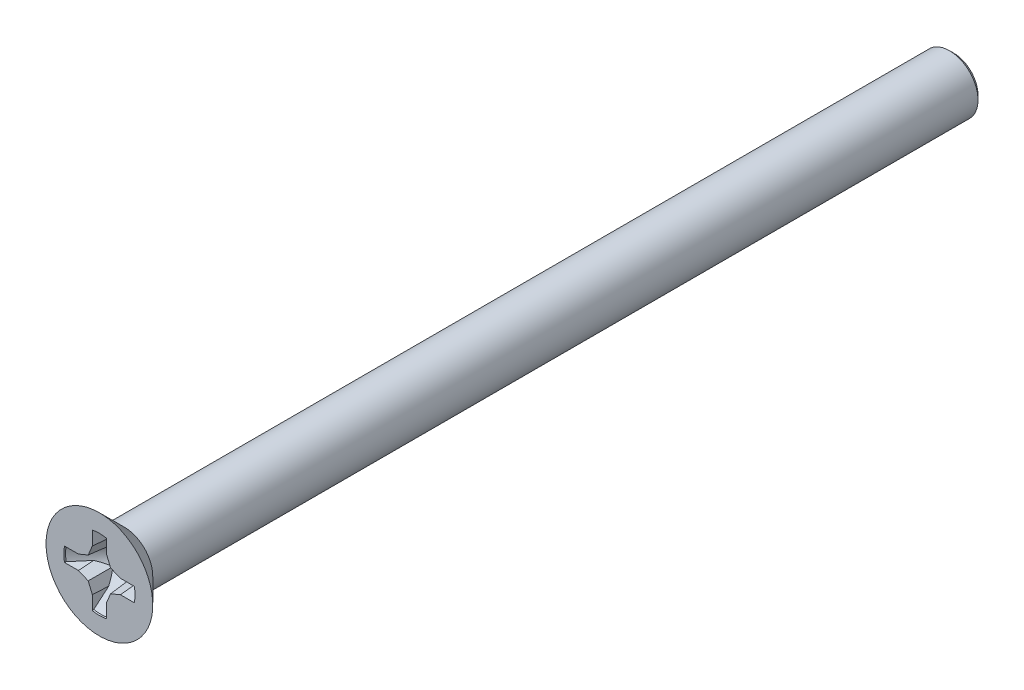
ISO-10303-21;
HEADER;
FILE_DESCRIPTION(('STEP AP214'),'2;1');
FILE_NAME('part.step','',(''),(''),'','','');
FILE_SCHEMA(('AUTOMOTIVE_DESIGN { 1 0 10303 214 1 1 1 1 }'));
ENDSEC;
DATA;
#1=APPLICATION_CONTEXT('core data for automotive mechanical design processes');
#2=APPLICATION_PROTOCOL_DEFINITION('international standard','automotive_design',2000,#1);
#3=PRODUCT_CONTEXT('',#1,'mechanical');
#4=PRODUCT('Part','Part','',(#3));
#5=PRODUCT_RELATED_PRODUCT_CATEGORY('part','',(#4));
#6=PRODUCT_DEFINITION_FORMATION('','',#4);
#7=PRODUCT_DEFINITION_CONTEXT('part definition',#1,'design');
#8=PRODUCT_DEFINITION('design','',#6,#7);
#9=PRODUCT_DEFINITION_SHAPE('','',#8);
#10=(LENGTH_UNIT() NAMED_UNIT(*) SI_UNIT(.MILLI.,.METRE.));
#11=(NAMED_UNIT(*) PLANE_ANGLE_UNIT() SI_UNIT($,.RADIAN.));
#12=(NAMED_UNIT(*) SI_UNIT($,.STERADIAN.) SOLID_ANGLE_UNIT());
#13=UNCERTAINTY_MEASURE_WITH_UNIT(LENGTH_MEASURE(1.E-05),#10,'distance_accuracy_value','');
#14=(GEOMETRIC_REPRESENTATION_CONTEXT(3) GLOBAL_UNCERTAINTY_ASSIGNED_CONTEXT((#13)) GLOBAL_UNIT_ASSIGNED_CONTEXT((#10,
#11,#12)) REPRESENTATION_CONTEXT('',''));
#15=CARTESIAN_POINT('',(0.,0.,0.));
#16=DIRECTION('',(0.,0.,1.));
#17=DIRECTION('',(1.,0.,0.));
#18=AXIS2_PLACEMENT_3D('',#15,#16,#17);
#19=CARTESIAN_POINT('',(0.500000000000026,-2.44948974278317,2.2));
#20=DIRECTION('',(-0.996194698091746,0.,0.0871557427476584));
#21=DIRECTION('',(0.,1.,0.));
#22=AXIS2_PLACEMENT_3D('',#19,#20,#21);
#23=PLANE('',#22);
#24=CARTESIAN_POINT('',(0.407324383999236,-1.45631054521119,1.14071286192047));
#25=CARTESIAN_POINT('',(0.438895455571679,-1.82218846608027,1.50157186124767));
#26=CARTESIAN_POINT('',(0.491456261529248,-2.42452511645569,2.1023446224179));
#27=(BOUNDED_CURVE() B_SPLINE_CURVE(2,(#24,#25,#26),.UNSPECIFIED.,.F.,
.F.) B_SPLINE_CURVE_WITH_KNOTS((3,3),(-0.0502307633060338,-0.0167180936561359),
.UNSPECIFIED.) CURVE() GEOMETRIC_REPRESENTATION_ITEM() RATIONAL_B_SPLINE_CURVE((2.16666900214285,
1.79889986437871,1.40255352692601)) REPRESENTATION_ITEM(''));
#28=CARTESIAN_POINT('',(0.407324383999526,-1.45631054521456,1.14071286192379));
#29=VERTEX_POINT('',#28);
#30=CARTESIAN_POINT('',(0.491456261529248,-2.42452511645569,2.1023446224179));
#31=VERTEX_POINT('',#30);
#32=EDGE_CURVE('E292',#29,#31,#27,.T.);
#33=ORIENTED_EDGE('',*,*,#32,.T.);
#34=DIRECTION('',(0.0844599239044589,-0.246790143112909,0.965381347715172));
#35=VECTOR('',#34,1.);
#36=CARTESIAN_POINT('',(0.491456261529248,-2.42452511645569,2.1023446224179));
#37=LINE('',#36,#35);
#38=CARTESIAN_POINT('',(0.500000000000026,-2.44948974278317,2.2));
#39=VERTEX_POINT('',#38);
#40=EDGE_CURVE('E413',#31,#39,#37,.T.);
#41=ORIENTED_EDGE('',*,*,#40,.T.);
#42=DIRECTION('',(0.,1.,0.));
#43=VECTOR('',#42,1.);
#44=CARTESIAN_POINT('',(0.500000000000026,-2.44948974278317,2.2));
#45=LINE('',#44,#43);
#46=CARTESIAN_POINT('',(0.500000000000016,-1.47474487139158,2.2));
#47=VERTEX_POINT('',#46);
#48=EDGE_CURVE('E456',#39,#47,#45,.T.);
#49=ORIENTED_EDGE('',*,*,#48,.T.);
#50=DIRECTION('',(0.0871426484044399,-0.0173337504938593,0.996045029063886));
#51=VECTOR('',#50,1.);
#52=CARTESIAN_POINT('',(0.500000000000016,-1.47474487139158,2.2));
#53=LINE('',#52,#51);
#54=EDGE_CURVE('E10',#29,#47,#53,.T.);
#55=ORIENTED_EDGE('',*,*,#54,.F.);
#56=EDGE_LOOP('',(#33,#41,#49,#55));
#57=FACE_BOUND('',#56,.T.);
#58=ADVANCED_FACE('F16',(#57),#23,.T.);
#59=CARTESIAN_POINT('',(0.500000000000016,-1.47474487139158,2.2));
#60=DIRECTION('',(-0.920363891963228,0.381227206369644,0.0871557427476583));
#61=DIRECTION('',(0.0942752822069814,0.,0.995546167269401));
#62=AXIS2_PLACEMENT_3D('',#59,#60,#61);
#63=PLANE('',#62);
#64=CARTESIAN_POINT('',(0.677460402999254,-0.677460402997918,0.58658499186893));
#65=CARTESIAN_POINT('',(0.568014544026815,-0.971532360593278,0.717135358188932));
#66=CARTESIAN_POINT('',(0.40732438399968,-1.4563105452141,1.14071286192338));
#67=(BOUNDED_CURVE() B_SPLINE_CURVE(2,(#64,#65,#66),.UNSPECIFIED.,.F.,
.F.) B_SPLINE_CURVE_WITH_KNOTS((3,3),(-0.314713883632195,-0.142510550070693),
.UNSPECIFIED.) CURVE() GEOMETRIC_REPRESENTATION_ITEM() RATIONAL_B_SPLINE_CURVE((2.54190043462429,
2.36011495061725,1.91562167133786)) REPRESENTATION_ITEM(''));
#68=CARTESIAN_POINT('',(0.677460402998895,-0.677460402998881,0.586584991869358));
#69=VERTEX_POINT('',#68);
#70=EDGE_CURVE('E261',#69,#29,#67,.T.);
#71=ORIENTED_EDGE('',*,*,#70,.T.);
#72=ORIENTED_EDGE('',*,*,#54,.T.);
#73=DIRECTION('',(0.38268343236508,0.923879532511291,0.));
#74=VECTOR('',#73,1.);
#75=CARTESIAN_POINT('',(0.500000000000016,-1.47474487139158,2.2));
#76=LINE('',#75,#74);
#77=CARTESIAN_POINT('',(0.785496162903796,-0.785496162903779,2.2));
#78=VERTEX_POINT('',#77);
#79=EDGE_CURVE('E408',#47,#78,#76,.T.);
#80=ORIENTED_EDGE('',*,*,#79,.T.);
#81=DIRECTION('',(0.066662691346833,-0.0666626913468316,0.995546167269401));
#82=VECTOR('',#81,1.);
#83=CARTESIAN_POINT('',(0.785496162903796,-0.785496162903779,2.2));
#84=LINE('',#83,#82);
#85=EDGE_CURVE('E27',#69,#78,#84,.T.);
#86=ORIENTED_EDGE('',*,*,#85,.F.);
#87=EDGE_LOOP('',(#71,#72,#80,#86));
#88=FACE_BOUND('',#87,.T.);
#89=ADVANCED_FACE('F544',(#88),#63,.T.);
#90=CARTESIAN_POINT('',(0.785496162903796,-0.785496162903779,2.2));
#91=DIRECTION('',(-0.381227206369663,0.92036389196322,0.0871557427476584));
#92=DIRECTION('',(0.222868776578231,0.,0.974848454082235));
#93=AXIS2_PLACEMENT_3D('',#90,#91,#92);
#94=PLANE('',#93);
#95=CARTESIAN_POINT('',(1.45631054521411,-0.407324383999649,1.14071286192338));
#96=CARTESIAN_POINT('',(0.971532360593293,-0.568014544026793,0.717135358188936));
#97=CARTESIAN_POINT('',(0.677460402997936,-0.677460402999238,0.586584991868932));
#98=(BOUNDED_CURVE() B_SPLINE_CURVE(2,(#95,#96,#97),.UNSPECIFIED.,.F.,
.F.) B_SPLINE_CURVE_WITH_KNOTS((3,3),(-0.725235736114305,-0.553032402552804),
.UNSPECIFIED.) CURVE() GEOMETRIC_REPRESENTATION_ITEM() RATIONAL_B_SPLINE_CURVE((1.91562167133786,
2.36011495061725,2.54190043462429)) REPRESENTATION_ITEM(''));
#99=CARTESIAN_POINT('',(1.45631054521457,-0.407324383999496,1.14071286192379));
#100=VERTEX_POINT('',#99);
#101=EDGE_CURVE('E254',#100,#69,#98,.T.);
#102=ORIENTED_EDGE('',*,*,#101,.T.);
#103=ORIENTED_EDGE('',*,*,#85,.T.);
#104=DIRECTION('',(0.923879532511283,0.3826834323651,0.));
#105=VECTOR('',#104,1.);
#106=CARTESIAN_POINT('',(0.785496162903796,-0.785496162903779,2.2));
#107=LINE('',#106,#105);
#108=CARTESIAN_POINT('',(1.47474487139159,-0.499999999999985,2.2));
#109=VERTEX_POINT('',#108);
#110=EDGE_CURVE('E335',#78,#109,#107,.T.);
#111=ORIENTED_EDGE('',*,*,#110,.T.);
#112=DIRECTION('',(0.0173337504938611,-0.0871426484044395,0.996045029063886));
#113=VECTOR('',#112,1.);
#114=CARTESIAN_POINT('',(1.47474487139159,-0.499999999999985,2.2));
#115=LINE('',#114,#113);
#116=EDGE_CURVE('E286',#100,#109,#115,.T.);
#117=ORIENTED_EDGE('',*,*,#116,.F.);
#118=EDGE_LOOP('',(#102,#103,#111,#117));
#119=FACE_BOUND('',#118,.T.);
#120=ADVANCED_FACE('F550',(#119),#94,.T.);
#121=CARTESIAN_POINT('',(1.47474487139159,-0.499999999999985,2.2));
#122=DIRECTION('',(0.,0.996194698091746,0.0871557427476584));
#123=DIRECTION('',(1.,0.,1.19723442951276E-13));
#124=AXIS2_PLACEMENT_3D('',#121,#122,#123);
#125=PLANE('',#124);
#126=CARTESIAN_POINT('',(2.42452511645571,-0.491456261529207,2.10234462241791));
#127=CARTESIAN_POINT('',(1.82218846608288,-0.438895455571875,1.50157186125027));
#128=CARTESIAN_POINT('',(1.45631054521457,-0.407324383999502,1.14071286192379));
#129=(BOUNDED_CURVE() B_SPLINE_CURVE(2,(#126,#127,#128),.UNSPECIFIED.,.F.,
.F.) B_SPLINE_CURVE_WITH_KNOTS((3,3),(-0.946313996596915,-0.912801326947203),
.UNSPECIFIED.) CURVE() GEOMETRIC_REPRESENTATION_ITEM() RATIONAL_B_SPLINE_CURVE((1.40255352692601,
1.79889986437651,2.16666900213877)) REPRESENTATION_ITEM(''));
#130=CARTESIAN_POINT('',(2.4245251164557,-0.491456261529198,2.1023446224179));
#131=VERTEX_POINT('',#130);
#132=EDGE_CURVE('E228',#131,#100,#129,.T.);
#133=ORIENTED_EDGE('',*,*,#132,.T.);
#134=ORIENTED_EDGE('',*,*,#116,.T.);
#135=DIRECTION('',(1.,0.,0.));
#136=VECTOR('',#135,1.);
#137=CARTESIAN_POINT('',(1.47474487139159,-0.499999999999985,2.2));
#138=LINE('',#137,#136);
#139=CARTESIAN_POINT('',(2.44948974278318,-0.499999999999975,2.2));
#140=VERTEX_POINT('',#139);
#141=EDGE_CURVE('E231',#109,#140,#138,.T.);
#142=ORIENTED_EDGE('',*,*,#141,.T.);
#143=DIRECTION('',(0.246790143112909,-0.0844599239044548,0.965381347715173));
#144=VECTOR('',#143,1.);
#145=CARTESIAN_POINT('',(2.4245251164557,-0.491456261529198,2.1023446224179));
#146=LINE('',#145,#144);
#147=EDGE_CURVE('E224',#131,#140,#146,.T.);
#148=ORIENTED_EDGE('',*,*,#147,.F.);
#149=EDGE_LOOP('',(#133,#134,#142,#148));
#150=FACE_BOUND('',#149,.T.);
#151=ADVANCED_FACE('F226',(#150),#125,.T.);
#152=CARTESIAN_POINT('',(-2.44948974278317,-0.500000000000017,2.2));
#153=DIRECTION('',(0.,0.996194698091746,0.0871557427476584));
#154=DIRECTION('',(1.,0.,0.));
#155=AXIS2_PLACEMENT_3D('',#152,#153,#154);
#156=PLANE('',#155);
#157=CARTESIAN_POINT('',(-1.4563105452112,-0.407324383999231,1.14071286192047));
#158=CARTESIAN_POINT('',(-1.82218846608027,-0.438895455571672,1.50157186124767));
#159=CARTESIAN_POINT('',(-2.42452511645569,-0.49145626152924,2.1023446224179));
#160=(BOUNDED_CURVE() B_SPLINE_CURVE(2,(#157,#158,#159),.UNSPECIFIED.,.F.,
.F.) B_SPLINE_CURVE_WITH_KNOTS((3,3),(-0.0502307633060338,-0.0167180936561359),
.UNSPECIFIED.) CURVE() GEOMETRIC_REPRESENTATION_ITEM() RATIONAL_B_SPLINE_CURVE((2.16666900214285,
1.79889986437871,1.40255352692601)) REPRESENTATION_ITEM(''));
#161=CARTESIAN_POINT('',(-1.45631054521456,-0.407324383999521,1.14071286192379));
#162=VERTEX_POINT('',#161);
#163=CARTESIAN_POINT('',(-2.42452511645569,-0.49145626152924,2.1023446224179));
#164=VERTEX_POINT('',#163);
#165=EDGE_CURVE('E599',#162,#164,#160,.T.);
#166=ORIENTED_EDGE('',*,*,#165,.T.);
#167=DIRECTION('',(-0.246790143112909,-0.0844599239044562,0.965381347715173));
#168=VECTOR('',#167,1.);
#169=CARTESIAN_POINT('',(-2.42452511645569,-0.49145626152924,2.1023446224179));
#170=LINE('',#169,#168);
#171=CARTESIAN_POINT('',(-2.44948974278317,-0.500000000000017,2.2));
#172=VERTEX_POINT('',#171);
#173=EDGE_CURVE('E291',#164,#172,#170,.T.);
#174=ORIENTED_EDGE('',*,*,#173,.T.);
#175=DIRECTION('',(1.,0.,0.));
#176=VECTOR('',#175,1.);
#177=CARTESIAN_POINT('',(-2.44948974278317,-0.500000000000017,2.2));
#178=LINE('',#177,#176);
#179=CARTESIAN_POINT('',(-1.47474487139159,-0.50000000000001,2.2));
#180=VERTEX_POINT('',#179);
#181=EDGE_CURVE('E348',#172,#180,#178,.T.);
#182=ORIENTED_EDGE('',*,*,#181,.T.);
#183=DIRECTION('',(-0.0173337504938596,-0.0871426484044398,0.996045029063886));
#184=VECTOR('',#183,1.);
#185=CARTESIAN_POINT('',(-1.47474487139159,-0.50000000000001,2.2));
#186=LINE('',#185,#184);
#187=EDGE_CURVE('E280',#162,#180,#186,.T.);
#188=ORIENTED_EDGE('',*,*,#187,.F.);
#189=EDGE_LOOP('',(#166,#174,#182,#188));
#190=FACE_BOUND('',#189,.T.);
#191=ADVANCED_FACE('F588',(#190),#156,.T.);
#192=CARTESIAN_POINT('',(-1.47474487139159,-0.50000000000001,2.2));
#193=DIRECTION('',(0.381227206369647,0.920363891963227,0.0871557427476583));
#194=DIRECTION('',(0.22286877657824,0.,-0.974848454082233));
#195=AXIS2_PLACEMENT_3D('',#192,#193,#194);
#196=PLANE('',#195);
#197=CARTESIAN_POINT('',(-0.67746040299792,-0.677460402999252,0.58658499186893));
#198=CARTESIAN_POINT('',(-0.971532360593278,-0.568014544026811,0.717135358188932));
#199=CARTESIAN_POINT('',(-1.4563105452141,-0.407324383999675,1.14071286192338));
#200=(BOUNDED_CURVE() B_SPLINE_CURVE(2,(#197,#198,#199),.UNSPECIFIED.,.F.,
.F.) B_SPLINE_CURVE_WITH_KNOTS((3,3),(-0.314713883632194,-0.142510550070693),
.UNSPECIFIED.) CURVE() GEOMETRIC_REPRESENTATION_ITEM() RATIONAL_B_SPLINE_CURVE((2.54190043462429,
2.36011495061725,1.91562167133786)) REPRESENTATION_ITEM(''));
#201=CARTESIAN_POINT('',(-0.677460402998883,-0.677460402998893,0.586584991869358));
#202=VERTEX_POINT('',#201);
#203=EDGE_CURVE('E279',#202,#162,#200,.T.);
#204=ORIENTED_EDGE('',*,*,#203,.T.);
#205=ORIENTED_EDGE('',*,*,#187,.T.);
#206=DIRECTION('',(0.92387953251129,-0.382683432365084,0.));
#207=VECTOR('',#206,1.);
#208=CARTESIAN_POINT('',(-1.47474487139159,-0.50000000000001,2.2));
#209=LINE('',#208,#207);
#210=CARTESIAN_POINT('',(-0.785496162903782,-0.785496162903793,2.2));
#211=VERTEX_POINT('',#210);
#212=EDGE_CURVE('E356',#180,#211,#209,.T.);
#213=ORIENTED_EDGE('',*,*,#212,.T.);
#214=DIRECTION('',(-0.0666626913468319,-0.0666626913468328,0.995546167269401));
#215=VECTOR('',#214,1.);
#216=CARTESIAN_POINT('',(-0.785496162903782,-0.785496162903793,2.2));
#217=LINE('',#216,#215);
#218=EDGE_CURVE('E287',#202,#211,#217,.T.);
#219=ORIENTED_EDGE('',*,*,#218,.F.);
#220=EDGE_LOOP('',(#204,#205,#213,#219));
#221=FACE_BOUND('',#220,.T.);
#222=ADVANCED_FACE('F559',(#221),#196,.T.);
#223=CARTESIAN_POINT('',(-0.785496162903782,-0.785496162903793,2.2));
#224=DIRECTION('',(0.920363891963222,0.38122720636966,0.0871557427476583));
#225=DIRECTION('',(0.,0.222868776578233,-0.974848454082234));
#226=AXIS2_PLACEMENT_3D('',#223,#224,#225);
#227=PLANE('',#226);
#228=CARTESIAN_POINT('',(-0.407324383999653,-1.45631054521411,1.14071286192339));
#229=CARTESIAN_POINT('',(-0.568014544026797,-0.971532360593289,0.717135358188932));
#230=CARTESIAN_POINT('',(-0.67746040299924,-0.67746040299793,0.58658499186893));
#231=(BOUNDED_CURVE() B_SPLINE_CURVE(2,(#228,#229,#230),.UNSPECIFIED.,.F.,
.F.) B_SPLINE_CURVE_WITH_KNOTS((3,3),(-0.725235736114305,-0.553032402552803),
.UNSPECIFIED.) CURVE() GEOMETRIC_REPRESENTATION_ITEM() RATIONAL_B_SPLINE_CURVE((1.91562167133786,
2.36011495061725,2.54190043462429)) REPRESENTATION_ITEM(''));
#232=CARTESIAN_POINT('',(-0.407324383999501,-1.45631054521457,1.14071286192379));
#233=VERTEX_POINT('',#232);
#234=EDGE_CURVE('E269',#233,#202,#231,.T.);
#235=ORIENTED_EDGE('',*,*,#234,.T.);
#236=ORIENTED_EDGE('',*,*,#218,.T.);
#237=DIRECTION('',(0.382683432365096,-0.923879532511284,0.));
#238=VECTOR('',#237,1.);
#239=CARTESIAN_POINT('',(-0.785496162903782,-0.785496162903793,2.2));
#240=LINE('',#239,#238);
#241=CARTESIAN_POINT('',(-0.49999999999999,-1.47474487139159,2.2));
#242=VERTEX_POINT('',#241);
#243=EDGE_CURVE('E400',#211,#242,#240,.T.);
#244=ORIENTED_EDGE('',*,*,#243,.T.);
#245=DIRECTION('',(-0.0871426484044396,-0.0173337504938608,0.996045029063886));
#246=VECTOR('',#245,1.);
#247=CARTESIAN_POINT('',(-0.49999999999999,-1.47474487139159,2.2));
#248=LINE('',#247,#246);
#249=EDGE_CURVE('E409',#233,#242,#248,.T.);
#250=ORIENTED_EDGE('',*,*,#249,.F.);
#251=EDGE_LOOP('',(#235,#236,#244,#250));
#252=FACE_BOUND('',#251,.T.);
#253=ADVANCED_FACE('F555',(#252),#227,.T.);
#254=CARTESIAN_POINT('',(-0.49999999999999,-1.47474487139159,2.2));
#255=DIRECTION('',(0.996194698091746,0.,0.0871557427476584));
#256=DIRECTION('',(0.,-1.,0.));
#257=AXIS2_PLACEMENT_3D('',#254,#255,#256);
#258=PLANE('',#257);
#259=CARTESIAN_POINT('',(-0.491456261529206,-2.4245251164557,2.1023446224179));
#260=CARTESIAN_POINT('',(-0.438895455571874,-1.82218846608288,1.50157186125026));
#261=CARTESIAN_POINT('',(-0.407324383999501,-1.45631054521457,1.14071286192379));
#262=(BOUNDED_CURVE() B_SPLINE_CURVE(2,(#259,#260,#261),.UNSPECIFIED.,.F.,
.F.) B_SPLINE_CURVE_WITH_KNOTS((3,3),(-0.946313996596915,-0.912801326947203),
.UNSPECIFIED.) CURVE() GEOMETRIC_REPRESENTATION_ITEM() RATIONAL_B_SPLINE_CURVE((1.40255352692601,
1.79889986437651,2.16666900213878)) REPRESENTATION_ITEM(''));
#263=CARTESIAN_POINT('',(-0.491456261529206,-2.4245251164557,2.1023446224179));
#264=VERTEX_POINT('',#263);
#265=EDGE_CURVE('E278',#264,#233,#262,.T.);
#266=ORIENTED_EDGE('',*,*,#265,.T.);
#267=ORIENTED_EDGE('',*,*,#249,.T.);
#268=DIRECTION('',(0.,-1.,0.));
#269=VECTOR('',#268,1.);
#270=CARTESIAN_POINT('',(-0.49999999999999,-1.47474487139159,2.2));
#271=LINE('',#270,#269);
#272=CARTESIAN_POINT('',(-0.499999999999983,-2.44948974278318,2.2));
#273=VERTEX_POINT('',#272);
#274=EDGE_CURVE('E444',#242,#273,#271,.T.);
#275=ORIENTED_EDGE('',*,*,#274,.T.);
#276=DIRECTION('',(-0.0844599239044562,-0.246790143112909,0.965381347715173));
#277=VECTOR('',#276,1.);
#278=CARTESIAN_POINT('',(-0.491456261529206,-2.4245251164557,2.1023446224179));
#279=LINE('',#278,#277);
#280=EDGE_CURVE('E442',#264,#273,#279,.T.);
#281=ORIENTED_EDGE('',*,*,#280,.F.);
#282=EDGE_LOOP('',(#266,#267,#275,#281));
#283=FACE_BOUND('',#282,.T.);
#284=ADVANCED_FACE('F558',(#283),#258,.T.);
#285=CARTESIAN_POINT('',(0.,0.,2.2));
#286=DIRECTION('',(0.,0.,1.));
#287=DIRECTION('',(-1.,0.,0.));
#288=AXIS2_PLACEMENT_3D('',#285,#286,#287);
#289=CONICAL_SURFACE('',#288,2.5,0.26179938779915);
#290=CARTESIAN_POINT('',(0.,0.,2.1023446224179));
#291=DIRECTION('',(0.,0.,-1.));
#292=DIRECTION('',(0.,-1.,0.));
#293=AXIS2_PLACEMENT_3D('',#290,#291,#292);
#294=CIRCLE('',#293,2.47383332044032);
#295=EDGE_CURVE('E297',#31,#264,#294,.T.);
#296=ORIENTED_EDGE('',*,*,#295,.T.);
#297=ORIENTED_EDGE('',*,*,#280,.T.);
#298=CARTESIAN_POINT('',(0.,0.,2.2));
#299=DIRECTION('',(0.,0.,1.));
#300=DIRECTION('',(-1.,0.,0.));
#301=AXIS2_PLACEMENT_3D('',#298,#299,#300);
#302=CIRCLE('',#301,2.5);
#303=EDGE_CURVE('E448',#273,#39,#302,.T.);
#304=ORIENTED_EDGE('',*,*,#303,.T.);
#305=ORIENTED_EDGE('',*,*,#40,.F.);
#306=EDGE_LOOP('',(#296,#297,#304,#305));
#307=FACE_BOUND('',#306,.T.);
#308=ADVANCED_FACE('F562',(#307),#289,.F.);
#309=CARTESIAN_POINT('',(-0.500000000000009,2.44948974278318,2.2));
#310=DIRECTION('',(0.996194698091746,0.,0.0871557427476584));
#311=DIRECTION('',(0.,-1.,0.));
#312=AXIS2_PLACEMENT_3D('',#309,#310,#311);
#313=PLANE('',#312);
#314=CARTESIAN_POINT('',(-0.407324383999231,1.4563105452112,1.14071286192047));
#315=CARTESIAN_POINT('',(-0.438895455571673,1.82218846608027,1.50157186124767));
#316=CARTESIAN_POINT('',(-0.49145626152924,2.42452511645569,2.10234462241791));
#317=(BOUNDED_CURVE() B_SPLINE_CURVE(2,(#314,#315,#316),.UNSPECIFIED.,.F.,
.F.) B_SPLINE_CURVE_WITH_KNOTS((3,3),(-0.0502307633060337,-0.0167180936561359),
.UNSPECIFIED.) CURVE() GEOMETRIC_REPRESENTATION_ITEM() RATIONAL_B_SPLINE_CURVE((2.16666900214285,
1.7988998643787,1.40255352692601)) REPRESENTATION_ITEM(''));
#318=CARTESIAN_POINT('',(-0.407324383999516,1.45631054521456,1.14071286192379));
#319=VERTEX_POINT('',#318);
#320=CARTESIAN_POINT('',(-0.491456261529231,2.42452511645569,2.1023446224179));
#321=VERTEX_POINT('',#320);
#322=EDGE_CURVE('E383',#319,#321,#317,.T.);
#323=ORIENTED_EDGE('',*,*,#322,.T.);
#324=DIRECTION('',(-0.0844599239044561,0.246790143112912,0.965381347715172));
#325=VECTOR('',#324,1.);
#326=CARTESIAN_POINT('',(-0.491456261529231,2.42452511645569,2.1023446224179));
#327=LINE('',#326,#325);
#328=CARTESIAN_POINT('',(-0.500000000000009,2.44948974278318,2.2));
#329=VERTEX_POINT('',#328);
#330=EDGE_CURVE('E428',#321,#329,#327,.T.);
#331=ORIENTED_EDGE('',*,*,#330,.T.);
#332=DIRECTION('',(0.,-1.,0.));
#333=VECTOR('',#332,1.);
#334=CARTESIAN_POINT('',(-0.500000000000009,2.44948974278318,2.2));
#335=LINE('',#334,#333);
#336=CARTESIAN_POINT('',(-0.5,1.47474487139159,2.2));
#337=VERTEX_POINT('',#336);
#338=EDGE_CURVE('E310',#329,#337,#335,.T.);
#339=ORIENTED_EDGE('',*,*,#338,.T.);
#340=DIRECTION('',(-0.0871426484044397,0.0173337504938599,0.996045029063886));
#341=VECTOR('',#340,1.);
#342=CARTESIAN_POINT('',(-0.5,1.47474487139159,2.2));
#343=LINE('',#342,#341);
#344=EDGE_CURVE('E509',#319,#337,#343,.T.);
#345=ORIENTED_EDGE('',*,*,#344,.F.);
#346=EDGE_LOOP('',(#323,#331,#339,#345));
#347=FACE_BOUND('',#346,.T.);
#348=ADVANCED_FACE('F573',(#347),#313,.T.);
#349=CARTESIAN_POINT('',(-0.5,1.47474487139159,2.2));
#350=DIRECTION('',(0.920363891963226,-0.38122720636965,0.0871557427476583));
#351=DIRECTION('',(0.,-0.222868776578239,-0.974848454082233));
#352=AXIS2_PLACEMENT_3D('',#349,#350,#351);
#353=PLANE('',#352);
#354=CARTESIAN_POINT('',(-0.677460402999248,0.677460402997922,0.58658499186893));
#355=CARTESIAN_POINT('',(-0.568014544026808,0.971532360593281,0.717135358188932));
#356=CARTESIAN_POINT('',(-0.40732438399967,1.4563105452141,1.14071286192338));
#357=(BOUNDED_CURVE() B_SPLINE_CURVE(2,(#354,#355,#356),.UNSPECIFIED.,.F.,
.F.) B_SPLINE_CURVE_WITH_KNOTS((3,3),(-0.314713883632194,-0.142510550070693),
.UNSPECIFIED.) CURVE() GEOMETRIC_REPRESENTATION_ITEM() RATIONAL_B_SPLINE_CURVE((2.54190043462429,
2.36011495061725,1.91562167133786)) REPRESENTATION_ITEM(''));
#358=CARTESIAN_POINT('',(-0.67746040299889,0.677460402998886,0.586584991869358));
#359=VERTEX_POINT('',#358);
#360=EDGE_CURVE('E376',#359,#319,#357,.T.);
#361=ORIENTED_EDGE('',*,*,#360,.T.);
#362=ORIENTED_EDGE('',*,*,#344,.T.);
#363=DIRECTION('',(-0.382683432365086,-0.923879532511288,0.));
#364=VECTOR('',#363,1.);
#365=CARTESIAN_POINT('',(-0.5,1.47474487139159,2.2));
#366=LINE('',#365,#364);
#367=CARTESIAN_POINT('',(-0.78549616290379,0.785496162903785,2.2));
#368=VERTEX_POINT('',#367);
#369=EDGE_CURVE('E304',#337,#368,#366,.T.);
#370=ORIENTED_EDGE('',*,*,#369,.T.);
#371=DIRECTION('',(-0.0666626913468326,0.0666626913468321,0.995546167269401));
#372=VECTOR('',#371,1.);
#373=CARTESIAN_POINT('',(-0.78549616290379,0.785496162903785,2.2));
#374=LINE('',#373,#372);
#375=EDGE_CURVE('E41',#359,#368,#374,.T.);
#376=ORIENTED_EDGE('',*,*,#375,.F.);
#377=EDGE_LOOP('',(#361,#362,#370,#376));
#378=FACE_BOUND('',#377,.T.);
#379=ADVANCED_FACE('F576',(#378),#353,.T.);
#380=CARTESIAN_POINT('',(-0.78549616290379,0.785496162903785,2.2));
#381=DIRECTION('',(0.381227206369657,-0.920363891963223,0.0871557427476584));
#382=DIRECTION('',(0.,-0.0942752822069821,-0.995546167269401));
#383=AXIS2_PLACEMENT_3D('',#380,#381,#382);
#384=PLANE('',#383);
#385=CARTESIAN_POINT('',(-1.4563105452141,0.40732438399966,1.14071286192338));
#386=CARTESIAN_POINT('',(-0.971532360593285,0.568014544026801,0.717135358188932));
#387=CARTESIAN_POINT('',(-0.677460402997928,0.677460402999244,0.58658499186893));
#388=(BOUNDED_CURVE() B_SPLINE_CURVE(2,(#385,#386,#387),.UNSPECIFIED.,.F.,
.F.) B_SPLINE_CURVE_WITH_KNOTS((3,3),(-0.725235736114304,-0.553032402552803),
.UNSPECIFIED.) CURVE() GEOMETRIC_REPRESENTATION_ITEM() RATIONAL_B_SPLINE_CURVE((1.91562167133786,
2.36011495061725,2.54190043462429)) REPRESENTATION_ITEM(''));
#389=CARTESIAN_POINT('',(-1.45631054521457,0.407324383999506,1.14071286192379));
#390=VERTEX_POINT('',#389);
#391=EDGE_CURVE('E382',#390,#359,#388,.T.);
#392=ORIENTED_EDGE('',*,*,#391,.T.);
#393=ORIENTED_EDGE('',*,*,#375,.T.);
#394=DIRECTION('',(-0.923879532511285,-0.382683432365093,0.));
#395=VECTOR('',#394,1.);
#396=CARTESIAN_POINT('',(-0.78549616290379,0.785496162903785,2.2));
#397=LINE('',#396,#395);
#398=CARTESIAN_POINT('',(-1.47474487139159,0.5,2.2));
#399=VERTEX_POINT('',#398);
#400=EDGE_CURVE('E302',#368,#399,#397,.T.);
#401=ORIENTED_EDGE('',*,*,#400,.T.);
#402=DIRECTION('',(-0.0173337504938605,0.0871426484044397,0.996045029063886));
#403=VECTOR('',#402,1.);
#404=CARTESIAN_POINT('',(-1.47474487139159,0.5,2.2));
#405=LINE('',#404,#403);
#406=EDGE_CURVE('E288',#390,#399,#405,.T.);
#407=ORIENTED_EDGE('',*,*,#406,.F.);
#408=EDGE_LOOP('',(#392,#393,#401,#407));
#409=FACE_BOUND('',#408,.T.);
#410=ADVANCED_FACE('F577',(#409),#384,.T.);
#411=CARTESIAN_POINT('',(-1.47474487139159,0.5,2.2));
#412=DIRECTION('',(0.,-0.996194698091746,0.0871557427476584));
#413=DIRECTION('',(-1.,0.,0.));
#414=AXIS2_PLACEMENT_3D('',#411,#412,#413);
#415=PLANE('',#414);
#416=CARTESIAN_POINT('',(-2.4245251164557,0.491456261529214,2.1023446224179));
#417=CARTESIAN_POINT('',(-1.82218846608288,0.43889545557188,1.50157186125026));
#418=CARTESIAN_POINT('',(-1.45631054521457,0.407324383999506,1.14071286192379));
#419=(BOUNDED_CURVE() B_SPLINE_CURVE(2,(#416,#417,#418),.UNSPECIFIED.,.F.,
.F.) B_SPLINE_CURVE_WITH_KNOTS((3,3),(-0.946313996596915,-0.912801326947203),
.UNSPECIFIED.) CURVE() GEOMETRIC_REPRESENTATION_ITEM() RATIONAL_B_SPLINE_CURVE((1.40255352692601,
1.79889986437651,2.16666900213878)) REPRESENTATION_ITEM(''));
#420=CARTESIAN_POINT('',(-2.4245251164557,0.491456261529215,2.1023446224179));
#421=VERTEX_POINT('',#420);
#422=EDGE_CURVE('E487',#421,#390,#419,.T.);
#423=ORIENTED_EDGE('',*,*,#422,.T.);
#424=ORIENTED_EDGE('',*,*,#406,.T.);
#425=DIRECTION('',(-1.,0.,0.));
#426=VECTOR('',#425,1.);
#427=CARTESIAN_POINT('',(-1.47474487139159,0.5,2.2));
#428=LINE('',#427,#426);
#429=CARTESIAN_POINT('',(-2.44948974278318,0.499999999999992,2.2));
#430=VERTEX_POINT('',#429);
#431=EDGE_CURVE('E305',#399,#430,#428,.T.);
#432=ORIENTED_EDGE('',*,*,#431,.T.);
#433=DIRECTION('',(-0.246790143112904,0.0844599239044577,0.965381347715174));
#434=VECTOR('',#433,1.);
#435=CARTESIAN_POINT('',(-2.4245251164557,0.491456261529215,2.1023446224179));
#436=LINE('',#435,#434);
#437=EDGE_CURVE('E267',#421,#430,#436,.T.);
#438=ORIENTED_EDGE('',*,*,#437,.F.);
#439=EDGE_LOOP('',(#423,#424,#432,#438));
#440=FACE_BOUND('',#439,.T.);
#441=ADVANCED_FACE('F580',(#440),#415,.T.);
#442=CARTESIAN_POINT('',(0.,0.,2.2));
#443=DIRECTION('',(0.,0.,1.));
#444=DIRECTION('',(0.,1.,0.));
#445=AXIS2_PLACEMENT_3D('',#442,#443,#444);
#446=CONICAL_SURFACE('',#445,2.5,0.26179938779915);
#447=CARTESIAN_POINT('',(0.,0.,2.1023446224179));
#448=DIRECTION('',(0.,0.,-1.));
#449=DIRECTION('',(0.,-1.,0.));
#450=AXIS2_PLACEMENT_3D('',#447,#448,#449);
#451=CIRCLE('',#450,2.47383332044032);
#452=CARTESIAN_POINT('',(-2.47383332044033,0.,2.10234462241791));
#453=VERTEX_POINT('',#452);
#454=EDGE_CURVE('E404',#164,#453,#451,.T.);
#455=ORIENTED_EDGE('',*,*,#454,.T.);
#456=CARTESIAN_POINT('',(0.,0.,2.1023446224179));
#457=DIRECTION('',(0.,0.,-1.));
#458=DIRECTION('',(0.,-1.,0.));
#459=AXIS2_PLACEMENT_3D('',#456,#457,#458);
#460=CIRCLE('',#459,2.47383332044032);
#461=EDGE_CURVE('E237',#453,#421,#460,.T.);
#462=ORIENTED_EDGE('',*,*,#461,.T.);
#463=ORIENTED_EDGE('',*,*,#437,.T.);
#464=CARTESIAN_POINT('',(0.,0.,2.2));
#465=DIRECTION('',(0.,0.,1.));
#466=DIRECTION('',(0.,1.,0.));
#467=AXIS2_PLACEMENT_3D('',#464,#465,#466);
#468=CIRCLE('',#467,2.5);
#469=EDGE_CURVE('E355',#430,#172,#468,.T.);
#470=ORIENTED_EDGE('',*,*,#469,.T.);
#471=ORIENTED_EDGE('',*,*,#173,.F.);
#472=EDGE_LOOP('',(#455,#462,#463,#470,#471));
#473=FACE_BOUND('',#472,.T.);
#474=ADVANCED_FACE('F571',(#473),#446,.F.);
#475=CARTESIAN_POINT('',(2.44948974278318,0.5,2.2));
#476=DIRECTION('',(0.,-0.996194698091746,0.0871557427476584));
#477=DIRECTION('',(-1.,0.,0.));
#478=AXIS2_PLACEMENT_3D('',#475,#476,#477);
#479=PLANE('',#478);
#480=CARTESIAN_POINT('',(1.45631054521456,0.407324383999511,1.14071286192379));
#481=CARTESIAN_POINT('',(1.82218846608287,0.438895455571887,1.50157186125026));
#482=CARTESIAN_POINT('',(2.42452511645569,0.491456261529224,2.1023446224179));
#483=(BOUNDED_CURVE() B_SPLINE_CURVE(2,(#480,#481,#482),.UNSPECIFIED.,.F.,
.F.) B_SPLINE_CURVE_WITH_KNOTS((3,3),(0.912801326947203,0.946313996596915),
.UNSPECIFIED.) CURVE() GEOMETRIC_REPRESENTATION_ITEM() RATIONAL_B_SPLINE_CURVE((2.16666900213878,
1.79889986437651,1.40255352692601)) REPRESENTATION_ITEM(''));
#484=CARTESIAN_POINT('',(1.45631054521456,0.407324383999511,1.14071286192379));
#485=VERTEX_POINT('',#484);
#486=CARTESIAN_POINT('',(2.4245251164557,0.491456261529223,2.1023446224179));
#487=VERTEX_POINT('',#486);
#488=EDGE_CURVE('E248',#485,#487,#483,.T.);
#489=ORIENTED_EDGE('',*,*,#488,.T.);
#490=DIRECTION('',(0.246790143112909,0.0844599239044548,0.965381347715173));
#491=VECTOR('',#490,1.);
#492=CARTESIAN_POINT('',(2.4245251164557,0.491456261529223,2.1023446224179));
#493=LINE('',#492,#491);
#494=CARTESIAN_POINT('',(2.44948974278318,0.5,2.2));
#495=VERTEX_POINT('',#494);
#496=EDGE_CURVE('E243',#487,#495,#493,.T.);
#497=ORIENTED_EDGE('',*,*,#496,.T.);
#498=DIRECTION('',(-1.,0.,0.));
#499=VECTOR('',#498,1.);
#500=CARTESIAN_POINT('',(2.44948974278318,0.5,2.2));
#501=LINE('',#500,#499);
#502=CARTESIAN_POINT('',(1.47474487139159,0.5,2.2));
#503=VERTEX_POINT('',#502);
#504=EDGE_CURVE('E336',#495,#503,#501,.T.);
#505=ORIENTED_EDGE('',*,*,#504,.T.);
#506=DIRECTION('',(0.0173337504938602,0.0871426484044397,0.996045029063886));
#507=VECTOR('',#506,1.);
#508=CARTESIAN_POINT('',(1.47474487139159,0.5,2.2));
#509=LINE('',#508,#507);
#510=EDGE_CURVE('E366',#485,#503,#509,.T.);
#511=ORIENTED_EDGE('',*,*,#510,.F.);
#512=EDGE_LOOP('',(#489,#497,#505,#511));
#513=FACE_BOUND('',#512,.T.);
#514=ADVANCED_FACE('F567',(#513),#479,.T.);
#515=CARTESIAN_POINT('',(1.47474487139159,0.5,2.2));
#516=DIRECTION('',(-0.381227206369653,-0.920363891963224,0.0871557427476585));
#517=DIRECTION('',(-0.923879532511287,0.38268343236509,0.));
#518=AXIS2_PLACEMENT_3D('',#515,#516,#517);
#519=PLANE('',#518);
#520=CARTESIAN_POINT('',(0.677460402997926,0.677460402999246,0.58658499186893));
#521=CARTESIAN_POINT('',(0.971532360593285,0.568014544026804,0.717135358188934));
#522=CARTESIAN_POINT('',(1.4563105452141,0.407324383999664,1.14071286192338));
#523=(BOUNDED_CURVE() B_SPLINE_CURVE(2,(#520,#521,#522),.UNSPECIFIED.,.F.,
.F.) B_SPLINE_CURVE_WITH_KNOTS((3,3),(0.553032402552804,0.725235736114305),
.UNSPECIFIED.) CURVE() GEOMETRIC_REPRESENTATION_ITEM() RATIONAL_B_SPLINE_CURVE((2.54190043462429,
2.36011495061725,1.91562167133786)) REPRESENTATION_ITEM(''));
#524=CARTESIAN_POINT('',(0.677460402998888,0.677460402998888,0.586584991869358));
#525=VERTEX_POINT('',#524);
#526=EDGE_CURVE('E347',#525,#485,#523,.T.);
#527=ORIENTED_EDGE('',*,*,#526,.T.);
#528=ORIENTED_EDGE('',*,*,#510,.T.);
#529=DIRECTION('',(-0.923879532511287,0.38268343236509,0.));
#530=VECTOR('',#529,1.);
#531=CARTESIAN_POINT('',(1.47474487139159,0.5,2.2));
#532=LINE('',#531,#530);
#533=CARTESIAN_POINT('',(0.785496162903787,0.785496162903787,2.2));
#534=VERTEX_POINT('',#533);
#535=EDGE_CURVE('E475',#503,#534,#532,.T.);
#536=ORIENTED_EDGE('',*,*,#535,.T.);
#537=DIRECTION('',(0.0666626913468323,0.0666626913468323,0.995546167269401));
#538=VECTOR('',#537,1.);
#539=CARTESIAN_POINT('',(0.785496162903787,0.785496162903787,2.2));
#540=LINE('',#539,#538);
#541=EDGE_CURVE('E363',#525,#534,#540,.T.);
#542=ORIENTED_EDGE('',*,*,#541,.F.);
#543=EDGE_LOOP('',(#527,#528,#536,#542));
#544=FACE_BOUND('',#543,.T.);
#545=ADVANCED_FACE('F570',(#544),#519,.T.);
#546=CARTESIAN_POINT('',(0.785496162903787,0.785496162903787,2.2));
#547=DIRECTION('',(-0.920363891963224,-0.381227206369654,0.0871557427476584));
#548=DIRECTION('',(-0.382683432365091,0.923879532511287,0.));
#549=AXIS2_PLACEMENT_3D('',#546,#547,#548);
#550=PLANE('',#549);
#551=CARTESIAN_POINT('',(0.407324383999664,1.4563105452141,1.14071286192338));
#552=CARTESIAN_POINT('',(0.568014544026804,0.971532360593282,0.717135358188932));
#553=CARTESIAN_POINT('',(0.677460402999246,0.677460402997926,0.58658499186893));
#554=(BOUNDED_CURVE() B_SPLINE_CURVE(2,(#551,#552,#553),.UNSPECIFIED.,.F.,
.F.) B_SPLINE_CURVE_WITH_KNOTS((3,3),(0.142510550070693,0.314713883632194),
.UNSPECIFIED.) CURVE() GEOMETRIC_REPRESENTATION_ITEM() RATIONAL_B_SPLINE_CURVE((1.91562167133786,
2.36011495061725,2.54190043462429)) REPRESENTATION_ITEM(''));
#555=CARTESIAN_POINT('',(0.407324383999511,1.45631054521456,1.14071286192379));
#556=VERTEX_POINT('',#555);
#557=EDGE_CURVE('E340',#556,#525,#554,.T.);
#558=ORIENTED_EDGE('',*,*,#557,.T.);
#559=ORIENTED_EDGE('',*,*,#541,.T.);
#560=DIRECTION('',(-0.38268343236509,0.923879532511287,0.));
#561=VECTOR('',#560,1.);
#562=CARTESIAN_POINT('',(0.785496162903787,0.785496162903787,2.2));
#563=LINE('',#562,#561);
#564=CARTESIAN_POINT('',(0.5,1.47474487139159,2.2));
#565=VERTEX_POINT('',#564);
#566=EDGE_CURVE('E20',#534,#565,#563,.T.);
#567=ORIENTED_EDGE('',*,*,#566,.T.);
#568=DIRECTION('',(0.0871426484044397,0.0173337504938602,0.996045029063886));
#569=VECTOR('',#568,1.);
#570=CARTESIAN_POINT('',(0.5,1.47474487139159,2.2));
#571=LINE('',#570,#569);
#572=EDGE_CURVE('E331',#556,#565,#571,.T.);
#573=ORIENTED_EDGE('',*,*,#572,.F.);
#574=EDGE_LOOP('',(#558,#559,#567,#573));
#575=FACE_BOUND('',#574,.T.);
#576=ADVANCED_FACE('F902',(#575),#550,.T.);
#577=CARTESIAN_POINT('',(0.5,1.47474487139159,2.2));
#578=DIRECTION('',(-0.996194698091746,0.,0.0871557427476584));
#579=DIRECTION('',(0.,1.,0.));
#580=AXIS2_PLACEMENT_3D('',#577,#578,#579);
#581=PLANE('',#580);
#582=CARTESIAN_POINT('',(0.491456261529224,2.4245251164557,2.1023446224179));
#583=CARTESIAN_POINT('',(0.43889545557166,1.82218846608027,1.50157186124767));
#584=CARTESIAN_POINT('',(0.40732438399922,1.4563105452112,1.14071286192047));
#585=(BOUNDED_CURVE() B_SPLINE_CURVE(2,(#582,#583,#584),.UNSPECIFIED.,.F.,
.F.) B_SPLINE_CURVE_WITH_KNOTS((3,3),(0.0167180936561359,0.0502307633060338),
.UNSPECIFIED.) CURVE() GEOMETRIC_REPRESENTATION_ITEM() RATIONAL_B_SPLINE_CURVE((1.40255352692601,
1.79889986437871,2.16666900214285)) REPRESENTATION_ITEM(''));
#586=CARTESIAN_POINT('',(0.491456261529223,2.4245251164557,2.1023446224179));
#587=VERTEX_POINT('',#586);
#588=EDGE_CURVE('E346',#587,#556,#585,.T.);
#589=ORIENTED_EDGE('',*,*,#588,.T.);
#590=ORIENTED_EDGE('',*,*,#572,.T.);
#591=DIRECTION('',(0.,1.,0.));
#592=VECTOR('',#591,1.);
#593=CARTESIAN_POINT('',(0.5,1.47474487139159,2.2));
#594=LINE('',#593,#592);
#595=CARTESIAN_POINT('',(0.5,2.44948974278318,2.2));
#596=VERTEX_POINT('',#595);
#597=EDGE_CURVE('E309',#565,#596,#594,.T.);
#598=ORIENTED_EDGE('',*,*,#597,.T.);
#599=DIRECTION('',(0.0844599239044597,0.246790143112907,0.965381347715173));
#600=VECTOR('',#599,1.);
#601=CARTESIAN_POINT('',(0.491456261529223,2.4245251164557,2.1023446224179));
#602=LINE('',#601,#600);
#603=EDGE_CURVE('E431',#587,#596,#602,.T.);
#604=ORIENTED_EDGE('',*,*,#603,.F.);
#605=EDGE_LOOP('',(#589,#590,#598,#604));
#606=FACE_BOUND('',#605,.T.);
#607=ADVANCED_FACE('F539',(#606),#581,.T.);
#608=CARTESIAN_POINT('',(0.,0.,2.2));
#609=DIRECTION('',(0.,0.,1.));
#610=DIRECTION('',(1.,0.,0.));
#611=AXIS2_PLACEMENT_3D('',#608,#609,#610);
#612=CONICAL_SURFACE('',#611,2.5,0.26179938779915);
#613=CARTESIAN_POINT('',(0.,0.,2.1023446224179));
#614=DIRECTION('',(0.,0.,-1.));
#615=DIRECTION('',(0.,-1.,0.));
#616=AXIS2_PLACEMENT_3D('',#613,#614,#615);
#617=CIRCLE('',#616,2.47383332044032);
#618=EDGE_CURVE('E437',#321,#587,#617,.T.);
#619=ORIENTED_EDGE('',*,*,#618,.T.);
#620=ORIENTED_EDGE('',*,*,#603,.T.);
#621=CARTESIAN_POINT('',(0.,0.,2.2));
#622=DIRECTION('',(0.,0.,1.));
#623=DIRECTION('',(1.,0.,0.));
#624=AXIS2_PLACEMENT_3D('',#621,#622,#623);
#625=CIRCLE('',#624,2.5);
#626=EDGE_CURVE('E306',#596,#329,#625,.T.);
#627=ORIENTED_EDGE('',*,*,#626,.T.);
#628=ORIENTED_EDGE('',*,*,#330,.F.);
#629=EDGE_LOOP('',(#619,#620,#627,#628));
#630=FACE_BOUND('',#629,.T.);
#631=ADVANCED_FACE('F530',(#630),#612,.F.);
#632=CARTESIAN_POINT('',(0.,2.,2.2));
#633=DIRECTION('',(0.,0.,-1.));
#634=DIRECTION('',(0.,-1.,0.));
#635=AXIS2_PLACEMENT_3D('',#632,#633,#634);
#636=PLANE('',#635);
#637=ORIENTED_EDGE('',*,*,#338,.F.);
#638=ORIENTED_EDGE('',*,*,#626,.F.);
#639=ORIENTED_EDGE('',*,*,#597,.F.);
#640=ORIENTED_EDGE('',*,*,#566,.F.);
#641=ORIENTED_EDGE('',*,*,#535,.F.);
#642=ORIENTED_EDGE('',*,*,#504,.F.);
#643=CARTESIAN_POINT('',(0.,0.,2.2));
#644=DIRECTION('',(0.,0.,1.));
#645=DIRECTION('',(1.,0.,0.));
#646=AXIS2_PLACEMENT_3D('',#643,#644,#645);
#647=CIRCLE('',#646,2.5);
#648=EDGE_CURVE('E236',#140,#495,#647,.T.);
#649=ORIENTED_EDGE('',*,*,#648,.F.);
#650=ORIENTED_EDGE('',*,*,#141,.F.);
#651=ORIENTED_EDGE('',*,*,#110,.F.);
#652=ORIENTED_EDGE('',*,*,#79,.F.);
#653=ORIENTED_EDGE('',*,*,#48,.F.);
#654=ORIENTED_EDGE('',*,*,#303,.F.);
#655=ORIENTED_EDGE('',*,*,#274,.F.);
#656=ORIENTED_EDGE('',*,*,#243,.F.);
#657=ORIENTED_EDGE('',*,*,#212,.F.);
#658=ORIENTED_EDGE('',*,*,#181,.F.);
#659=ORIENTED_EDGE('',*,*,#469,.F.);
#660=ORIENTED_EDGE('',*,*,#431,.F.);
#661=ORIENTED_EDGE('',*,*,#400,.F.);
#662=ORIENTED_EDGE('',*,*,#369,.F.);
#663=EDGE_LOOP('',(#637,#638,#639,#640,#641,#642,#649,#650,#651,#652,#653,#654,#655,#656,#657,
#658,#659,#660,#661,#662));
#664=FACE_BOUND('',#663,.T.);
#665=CARTESIAN_POINT('',(0.,0.,2.2));
#666=DIRECTION('',(0.,0.,-1.));
#667=DIRECTION('',(-1.,0.,0.));
#668=AXIS2_PLACEMENT_3D('',#665,#666,#667);
#669=CIRCLE('',#668,3.75);
#670=CARTESIAN_POINT('',(-3.75,0.,2.2));
#671=VERTEX_POINT('',#670);
#672=EDGE_CURVE('E327',#671,#671,#669,.T.);
#673=ORIENTED_EDGE('',*,*,#672,.F.);
#674=EDGE_LOOP('',(#673));
#675=FACE_BOUND('',#674,.T.);
#676=ADVANCED_FACE('F528',(#664,#675),#636,.F.);
#677=CARTESIAN_POINT('',(0.,0.,2.2));
#678=DIRECTION('',(0.,0.,1.));
#679=DIRECTION('',(1.,0.,0.));
#680=AXIS2_PLACEMENT_3D('',#677,#678,#679);
#681=CONICAL_SURFACE('',#680,3.75,0.78539816339745);
#682=ORIENTED_EDGE('',*,*,#672,.T.);
#683=DIRECTION('',(0.707106781186549,0.,-0.707106781186546));
#684=VECTOR('',#683,1.);
#685=CARTESIAN_POINT('',(-3.75,0.,2.2));
#686=LINE('',#685,#684);
#687=CARTESIAN_POINT('',(-2.,0.,0.450000000000008));
#688=VERTEX_POINT('',#687);
#689=EDGE_CURVE('E156',#671,#688,#686,.T.);
#690=ORIENTED_EDGE('',*,*,#689,.T.);
#691=CARTESIAN_POINT('',(0.,0.,0.450000000000008));
#692=DIRECTION('',(0.,0.,-1.));
#693=DIRECTION('',(1.,0.,0.));
#694=AXIS2_PLACEMENT_3D('',#691,#692,#693);
#695=CIRCLE('',#694,2.);
#696=CARTESIAN_POINT('',(0.,2.,0.450000000000008));
#697=VERTEX_POINT('',#696);
#698=EDGE_CURVE('E375',#697,#688,#695,.T.);
#699=ORIENTED_EDGE('',*,*,#698,.F.);
#700=CARTESIAN_POINT('',(0.,0.,0.450000000000008));
#701=DIRECTION('',(0.,0.,-1.));
#702=DIRECTION('',(1.,0.,0.));
#703=AXIS2_PLACEMENT_3D('',#700,#701,#702);
#704=CIRCLE('',#703,2.);
#705=EDGE_CURVE('E372',#688,#697,#704,.T.);
#706=ORIENTED_EDGE('',*,*,#705,.F.);
#707=ORIENTED_EDGE('',*,*,#689,.F.);
#708=EDGE_LOOP('',(#682,#690,#699,#706,#707));
#709=FACE_BOUND('',#708,.T.);
#710=ADVANCED_FACE('F526',(#709),#681,.T.);
#711=CARTESIAN_POINT('',(0.,0.,2.2));
#712=DIRECTION('',(0.,0.,1.));
#713=DIRECTION('',(1.,0.,0.));
#714=AXIS2_PLACEMENT_3D('',#711,#712,#713);
#715=CONICAL_SURFACE('',#714,2.5,0.26179938779915);
#716=CARTESIAN_POINT('',(0.,0.,2.1023446224179));
#717=DIRECTION('',(0.,0.,-1.));
#718=DIRECTION('',(0.,-1.,0.));
#719=AXIS2_PLACEMENT_3D('',#716,#717,#718);
#720=CIRCLE('',#719,2.47383332044032);
#721=EDGE_CURVE('E240',#487,#131,#720,.T.);
#722=ORIENTED_EDGE('',*,*,#721,.T.);
#723=ORIENTED_EDGE('',*,*,#147,.T.);
#724=ORIENTED_EDGE('',*,*,#648,.T.);
#725=ORIENTED_EDGE('',*,*,#496,.F.);
#726=EDGE_LOOP('',(#722,#723,#724,#725));
#727=FACE_BOUND('',#726,.T.);
#728=ADVANCED_FACE('F241',(#727),#715,.F.);
#729=CARTESIAN_POINT('',(0.,0.,2.78925565098879));
#730=DIRECTION('',(0.,0.,1.));
#731=DIRECTION('',(1.,0.,0.));
#732=AXIS2_PLACEMENT_3D('',#729,#730,#731);
#733=CONICAL_SURFACE('',#732,3.16074434901121,0.78539816339745);
#734=DIRECTION('',(-0.707106781186549,0.,0.707106781186546));
#735=VECTOR('',#734,1.);
#736=CARTESIAN_POINT('',(-3.16074434901121,0.,2.78925565098879));
#737=LINE('',#736,#735);
#738=CARTESIAN_POINT('',(0.,0.,-0.371488698022408));
#739=VERTEX_POINT('',#738);
#740=EDGE_CURVE('E401',#739,#453,#737,.T.);
#741=ORIENTED_EDGE('',*,*,#740,.T.);
#742=ORIENTED_EDGE('',*,*,#454,.F.);
#743=ORIENTED_EDGE('',*,*,#165,.F.);
#744=ORIENTED_EDGE('',*,*,#203,.F.);
#745=ORIENTED_EDGE('',*,*,#234,.F.);
#746=ORIENTED_EDGE('',*,*,#265,.F.);
#747=ORIENTED_EDGE('',*,*,#295,.F.);
#748=ORIENTED_EDGE('',*,*,#32,.F.);
#749=ORIENTED_EDGE('',*,*,#70,.F.);
#750=ORIENTED_EDGE('',*,*,#101,.F.);
#751=ORIENTED_EDGE('',*,*,#132,.F.);
#752=ORIENTED_EDGE('',*,*,#721,.F.);
#753=ORIENTED_EDGE('',*,*,#488,.F.);
#754=ORIENTED_EDGE('',*,*,#526,.F.);
#755=ORIENTED_EDGE('',*,*,#557,.F.);
#756=ORIENTED_EDGE('',*,*,#588,.F.);
#757=ORIENTED_EDGE('',*,*,#618,.F.);
#758=ORIENTED_EDGE('',*,*,#322,.F.);
#759=ORIENTED_EDGE('',*,*,#360,.F.);
#760=ORIENTED_EDGE('',*,*,#391,.F.);
#761=ORIENTED_EDGE('',*,*,#422,.F.);
#762=ORIENTED_EDGE('',*,*,#461,.F.);
#763=ORIENTED_EDGE('',*,*,#740,.F.);
#764=EDGE_LOOP('',(#741,#742,#743,#744,#745,#746,#747,#748,#749,#750,#751,#752,#753,#754,#755,
#756,#757,#758,#759,#760,#761,#762,#763));
#765=FACE_BOUND('',#764,.T.);
#766=ADVANCED_FACE('F251',(#765),#733,.F.);
#767=CARTESIAN_POINT('',(0.,0.,2.2));
#768=DIRECTION('',(0.,0.,1.));
#769=DIRECTION('',(0.,-1.,0.));
#770=AXIS2_PLACEMENT_3D('',#767,#768,#769);
#771=CYLINDRICAL_SURFACE('',#770,2.);
#772=ORIENTED_EDGE('',*,*,#698,.T.);
#773=ORIENTED_EDGE('',*,*,#705,.T.);
#774=DIRECTION('',(0.,0.,-1.));
#775=VECTOR('',#774,1.);
#776=CARTESIAN_POINT('',(0.,2.,2.2));
#777=LINE('',#776,#775);
#778=CARTESIAN_POINT('',(0.,2.,-57.5));
#779=VERTEX_POINT('',#778);
#780=EDGE_CURVE('E170',#697,#779,#777,.T.);
#781=ORIENTED_EDGE('',*,*,#780,.T.);
#782=CARTESIAN_POINT('',(0.,0.,-57.5));
#783=DIRECTION('',(0.,0.,-1.));
#784=DIRECTION('',(0.,-1.,0.));
#785=AXIS2_PLACEMENT_3D('',#782,#783,#784);
#786=CIRCLE('',#785,2.);
#787=EDGE_CURVE('E360',#779,#779,#786,.T.);
#788=ORIENTED_EDGE('',*,*,#787,.F.);
#789=ORIENTED_EDGE('',*,*,#780,.F.);
#790=EDGE_LOOP('',(#772,#773,#781,#788,#789));
#791=FACE_BOUND('',#790,.T.);
#792=ADVANCED_FACE('F18',(#791),#771,.T.);
#793=CARTESIAN_POINT('',(0.,0.,-57.8));
#794=DIRECTION('',(0.,0.,1.));
#795=DIRECTION('',(0.,-1.,0.));
#796=AXIS2_PLACEMENT_3D('',#793,#794,#795);
#797=PLANE('',#796);
#798=CARTESIAN_POINT('',(0.,0.,-57.8));
#799=DIRECTION('',(0.,0.,1.));
#800=DIRECTION('',(0.,-1.,0.));
#801=AXIS2_PLACEMENT_3D('',#798,#799,#800);
#802=CIRCLE('',#801,1.7);
#803=CARTESIAN_POINT('',(0.,1.7,-57.8));
#804=VERTEX_POINT('',#803);
#805=EDGE_CURVE('E361',#804,#804,#802,.T.);
#806=ORIENTED_EDGE('',*,*,#805,.F.);
#807=EDGE_LOOP('',(#806));
#808=FACE_BOUND('',#807,.T.);
#809=ADVANCED_FACE('F581',(#808),#797,.F.);
#810=CARTESIAN_POINT('',(0.,0.,-57.65));
#811=DIRECTION('',(0.,0.,1.));
#812=DIRECTION('',(0.,-1.,0.));
#813=AXIS2_PLACEMENT_3D('',#810,#811,#812);
#814=CONICAL_SURFACE('',#813,1.85,0.785398163397439);
#815=ORIENTED_EDGE('',*,*,#805,.T.);
#816=DIRECTION('',(0.,0.707106781186541,0.707106781186554));
#817=VECTOR('',#816,1.);
#818=CARTESIAN_POINT('',(0.,1.85,-57.65));
#819=LINE('',#818,#817);
#820=EDGE_CURVE('E357',#804,#779,#819,.T.);
#821=ORIENTED_EDGE('',*,*,#820,.T.);
#822=ORIENTED_EDGE('',*,*,#787,.T.);
#823=ORIENTED_EDGE('',*,*,#820,.F.);
#824=EDGE_LOOP('',(#815,#821,#822,#823));
#825=FACE_BOUND('',#824,.T.);
#826=ADVANCED_FACE('F584',(#825),#814,.T.);
#827=CLOSED_SHELL('',(#58,#89,#120,#151,#191,#222,#253,#284,#308,#348,#379,#410,#441,#474,#514,
#545,#576,#607,#631,#676,#710,#728,#766,#792,#809,#826));
#828=MANIFOLD_SOLID_BREP('B1',#827);
#829=ADVANCED_BREP_SHAPE_REPRESENTATION('',(#18,#828),#14);
#830=SHAPE_DEFINITION_REPRESENTATION(#9,#829);
ENDSEC;
END-ISO-10303-21;
